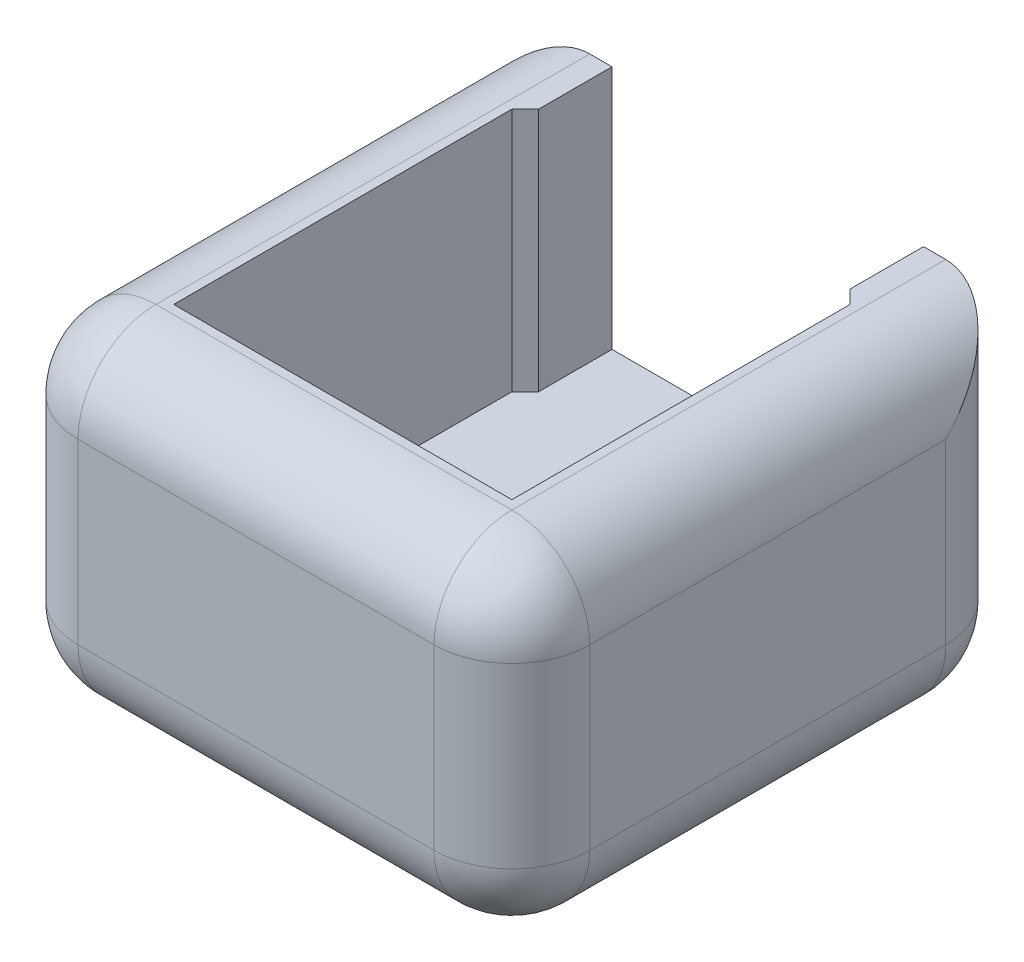
ISO-10303-21;
HEADER;
FILE_DESCRIPTION(('STEP AP214'),'2;1');
FILE_NAME('part.step','',(''),(''),'','','');
FILE_SCHEMA(('AUTOMOTIVE_DESIGN { 1 0 10303 214 1 1 1 1 }'));
ENDSEC;
DATA;
#1=APPLICATION_CONTEXT('core data for automotive mechanical design processes');
#2=APPLICATION_PROTOCOL_DEFINITION('international standard','automotive_design',2000,#1);
#3=PRODUCT_CONTEXT('',#1,'mechanical');
#4=PRODUCT('Part','Part','',(#3));
#5=PRODUCT_RELATED_PRODUCT_CATEGORY('part','',(#4));
#6=PRODUCT_DEFINITION_FORMATION('','',#4);
#7=PRODUCT_DEFINITION_CONTEXT('part definition',#1,'design');
#8=PRODUCT_DEFINITION('design','',#6,#7);
#9=PRODUCT_DEFINITION_SHAPE('','',#8);
#10=(LENGTH_UNIT() NAMED_UNIT(*) SI_UNIT(.MILLI.,.METRE.));
#11=(NAMED_UNIT(*) PLANE_ANGLE_UNIT() SI_UNIT($,.RADIAN.));
#12=(NAMED_UNIT(*) SI_UNIT($,.STERADIAN.) SOLID_ANGLE_UNIT());
#13=UNCERTAINTY_MEASURE_WITH_UNIT(LENGTH_MEASURE(1.E-05),#10,'distance_accuracy_value','');
#14=(GEOMETRIC_REPRESENTATION_CONTEXT(3) GLOBAL_UNCERTAINTY_ASSIGNED_CONTEXT((#13)) GLOBAL_UNIT_ASSIGNED_CONTEXT((#10,
#11,#12)) REPRESENTATION_CONTEXT('',''));
#15=CARTESIAN_POINT('',(0.,0.,0.));
#16=DIRECTION('',(0.,0.,1.));
#17=DIRECTION('',(1.,0.,0.));
#18=AXIS2_PLACEMENT_3D('',#15,#16,#17);
#19=CARTESIAN_POINT('',(23.,30.,23.));
#20=DIRECTION('',(-1.,0.,0.));
#21=DIRECTION('',(0.,0.,1.));
#22=AXIS2_PLACEMENT_3D('',#19,#20,#21);
#23=PLANE('',#22);
#24=DIRECTION('',(0.,0.,-1.));
#25=VECTOR('',#24,1.);
#26=CARTESIAN_POINT('',(23.,23.,23.));
#27=LINE('',#26,#25);
#28=CARTESIAN_POINT('',(23.,23.,-16.));
#29=VERTEX_POINT('',#28);
#30=CARTESIAN_POINT('',(23.,23.,16.));
#31=VERTEX_POINT('',#30);
#32=EDGE_CURVE('E294',#29,#31,#27,.F.);
#33=ORIENTED_EDGE('',*,*,#32,.T.);
#34=DIRECTION('',(0.,-1.,0.));
#35=VECTOR('',#34,1.);
#36=CARTESIAN_POINT('',(23.,30.,16.));
#37=LINE('',#36,#35);
#38=CARTESIAN_POINT('',(23.,7.,16.));
#39=VERTEX_POINT('',#38);
#40=EDGE_CURVE('E301',#31,#39,#37,.T.);
#41=ORIENTED_EDGE('',*,*,#40,.T.);
#42=DIRECTION('',(0.,0.,-1.));
#43=VECTOR('',#42,1.);
#44=CARTESIAN_POINT('',(23.,7.,-23.));
#45=LINE('',#44,#43);
#46=CARTESIAN_POINT('',(23.,7.,-16.));
#47=VERTEX_POINT('',#46);
#48=EDGE_CURVE('E297',#39,#47,#45,.T.);
#49=ORIENTED_EDGE('',*,*,#48,.T.);
#50=DIRECTION('',(0.,-1.,0.));
#51=VECTOR('',#50,1.);
#52=CARTESIAN_POINT('',(23.,30.,-16.));
#53=LINE('',#52,#51);
#54=EDGE_CURVE('E291',#47,#29,#53,.F.);
#55=ORIENTED_EDGE('',*,*,#54,.T.);
#56=EDGE_LOOP('',(#33,#41,#49,#55));
#57=FACE_BOUND('',#56,.T.);
#58=ADVANCED_FACE('F41',(#57),#23,.F.);
#59=CARTESIAN_POINT('',(-23.,30.,-23.));
#60=DIRECTION('',(0.,0.,1.));
#61=DIRECTION('',(1.,0.,0.));
#62=AXIS2_PLACEMENT_3D('',#59,#60,#61);
#63=PLANE('',#62);
#64=DIRECTION('',(-1.,0.,0.));
#65=VECTOR('',#64,1.);
#66=CARTESIAN_POINT('',(-23.,7.,-23.));
#67=LINE('',#66,#65);
#68=CARTESIAN_POINT('',(16.,7.,-23.));
#69=VERTEX_POINT('',#68);
#70=CARTESIAN_POINT('',(-16.,7.,-23.));
#71=VERTEX_POINT('',#70);
#72=EDGE_CURVE('E246',#69,#71,#67,.T.);
#73=ORIENTED_EDGE('',*,*,#72,.T.);
#74=DIRECTION('',(0.,-1.,0.));
#75=VECTOR('',#74,1.);
#76=CARTESIAN_POINT('',(-16.,30.,-23.));
#77=LINE('',#76,#75);
#78=CARTESIAN_POINT('',(-16.,30.,-23.));
#79=VERTEX_POINT('',#78);
#80=EDGE_CURVE('E249',#71,#79,#77,.F.);
#81=ORIENTED_EDGE('',*,*,#80,.T.);
#82=DIRECTION('',(-1.,0.,0.));
#83=VECTOR('',#82,1.);
#84=CARTESIAN_POINT('',(-23.,30.,-23.));
#85=LINE('',#84,#83);
#86=CARTESIAN_POINT('',(-14.,30.,-23.));
#87=VERTEX_POINT('',#86);
#88=EDGE_CURVE('E194',#87,#79,#85,.T.);
#89=ORIENTED_EDGE('',*,*,#88,.F.);
#90=DIRECTION('',(0.,1.,0.));
#91=VECTOR('',#90,1.);
#92=CARTESIAN_POINT('',(-14.,-21.0661314935442,-23.));
#93=LINE('',#92,#91);
#94=CARTESIAN_POINT('',(-14.,8.,-23.));
#95=VERTEX_POINT('',#94);
#96=EDGE_CURVE('E174',#95,#87,#93,.T.);
#97=ORIENTED_EDGE('',*,*,#96,.F.);
#98=DIRECTION('',(-1.,0.,0.));
#99=VECTOR('',#98,1.);
#100=CARTESIAN_POINT('',(-14.,8.,-23.));
#101=LINE('',#100,#99);
#102=CARTESIAN_POINT('',(14.,8.,-23.));
#103=VERTEX_POINT('',#102);
#104=EDGE_CURVE('E181',#103,#95,#101,.T.);
#105=ORIENTED_EDGE('',*,*,#104,.F.);
#106=DIRECTION('',(0.,1.,0.));
#107=VECTOR('',#106,1.);
#108=CARTESIAN_POINT('',(14.,-21.0661314935442,-23.));
#109=LINE('',#108,#107);
#110=CARTESIAN_POINT('',(14.,30.,-23.));
#111=VERTEX_POINT('',#110);
#112=EDGE_CURVE('E199',#103,#111,#109,.T.);
#113=ORIENTED_EDGE('',*,*,#112,.T.);
#114=CARTESIAN_POINT('',(16.,30.,-23.));
#115=VERTEX_POINT('',#114);
#116=EDGE_CURVE('E239',#115,#111,#85,.T.);
#117=ORIENTED_EDGE('',*,*,#116,.F.);
#118=DIRECTION('',(0.,-1.,0.));
#119=VECTOR('',#118,1.);
#120=CARTESIAN_POINT('',(16.,30.,-23.));
#121=LINE('',#120,#119);
#122=EDGE_CURVE('E243',#115,#69,#121,.T.);
#123=ORIENTED_EDGE('',*,*,#122,.T.);
#124=EDGE_LOOP('',(#73,#81,#89,#97,#105,#113,#117,#123));
#125=FACE_BOUND('',#124,.T.);
#126=ADVANCED_FACE('F192',(#125),#63,.F.);
#127=CARTESIAN_POINT('',(-23.,30.,23.));
#128=DIRECTION('',(1.,0.,0.));
#129=DIRECTION('',(0.,0.,-1.));
#130=AXIS2_PLACEMENT_3D('',#127,#128,#129);
#131=PLANE('',#130);
#132=DIRECTION('',(0.,0.,1.));
#133=VECTOR('',#132,1.);
#134=CARTESIAN_POINT('',(-23.,23.,23.));
#135=LINE('',#134,#133);
#136=CARTESIAN_POINT('',(-23.,23.,16.));
#137=VERTEX_POINT('',#136);
#138=CARTESIAN_POINT('',(-23.,23.,-16.));
#139=VERTEX_POINT('',#138);
#140=EDGE_CURVE('E268',#137,#139,#135,.F.);
#141=ORIENTED_EDGE('',*,*,#140,.T.);
#142=DIRECTION('',(0.,-1.,0.));
#143=VECTOR('',#142,1.);
#144=CARTESIAN_POINT('',(-23.,30.,-16.));
#145=LINE('',#144,#143);
#146=CARTESIAN_POINT('',(-23.,7.,-16.));
#147=VERTEX_POINT('',#146);
#148=EDGE_CURVE('E275',#139,#147,#145,.T.);
#149=ORIENTED_EDGE('',*,*,#148,.T.);
#150=DIRECTION('',(0.,0.,1.));
#151=VECTOR('',#150,1.);
#152=CARTESIAN_POINT('',(-23.,7.,23.));
#153=LINE('',#152,#151);
#154=CARTESIAN_POINT('',(-23.,7.,16.));
#155=VERTEX_POINT('',#154);
#156=EDGE_CURVE('E271',#147,#155,#153,.T.);
#157=ORIENTED_EDGE('',*,*,#156,.T.);
#158=DIRECTION('',(0.,-1.,0.));
#159=VECTOR('',#158,1.);
#160=CARTESIAN_POINT('',(-23.,30.,16.));
#161=LINE('',#160,#159);
#162=EDGE_CURVE('E265',#155,#137,#161,.F.);
#163=ORIENTED_EDGE('',*,*,#162,.T.);
#164=EDGE_LOOP('',(#141,#149,#157,#163));
#165=FACE_BOUND('',#164,.T.);
#166=ADVANCED_FACE('F439',(#165),#131,.F.);
#167=CARTESIAN_POINT('',(-23.,30.,23.));
#168=DIRECTION('',(0.,0.,-1.));
#169=DIRECTION('',(-1.,0.,0.));
#170=AXIS2_PLACEMENT_3D('',#167,#168,#169);
#171=PLANE('',#170);
#172=DIRECTION('',(1.,0.,0.));
#173=VECTOR('',#172,1.);
#174=CARTESIAN_POINT('',(-23.,23.,23.));
#175=LINE('',#174,#173);
#176=CARTESIAN_POINT('',(16.,23.,23.));
#177=VERTEX_POINT('',#176);
#178=CARTESIAN_POINT('',(-16.,23.,23.));
#179=VERTEX_POINT('',#178);
#180=EDGE_CURVE('E281',#177,#179,#175,.F.);
#181=ORIENTED_EDGE('',*,*,#180,.T.);
#182=DIRECTION('',(0.,-1.,0.));
#183=VECTOR('',#182,1.);
#184=CARTESIAN_POINT('',(-16.,30.,23.));
#185=LINE('',#184,#183);
#186=CARTESIAN_POINT('',(-16.,7.,23.));
#187=VERTEX_POINT('',#186);
#188=EDGE_CURVE('E288',#179,#187,#185,.T.);
#189=ORIENTED_EDGE('',*,*,#188,.T.);
#190=DIRECTION('',(1.,0.,0.));
#191=VECTOR('',#190,1.);
#192=CARTESIAN_POINT('',(23.,7.,23.));
#193=LINE('',#192,#191);
#194=CARTESIAN_POINT('',(16.,7.,23.));
#195=VERTEX_POINT('',#194);
#196=EDGE_CURVE('E284',#187,#195,#193,.T.);
#197=ORIENTED_EDGE('',*,*,#196,.T.);
#198=DIRECTION('',(0.,-1.,0.));
#199=VECTOR('',#198,1.);
#200=CARTESIAN_POINT('',(16.,30.,23.));
#201=LINE('',#200,#199);
#202=EDGE_CURVE('E278',#195,#177,#201,.F.);
#203=ORIENTED_EDGE('',*,*,#202,.T.);
#204=EDGE_LOOP('',(#181,#189,#197,#203));
#205=FACE_BOUND('',#204,.T.);
#206=ADVANCED_FACE('F528',(#205),#171,.F.);
#207=CARTESIAN_POINT('',(0.,30.,0.));
#208=DIRECTION('',(0.,-1.,0.));
#209=DIRECTION('',(0.,0.,-1.));
#210=AXIS2_PLACEMENT_3D('',#207,#208,#209);
#211=PLANE('',#210);
#212=DIRECTION('',(0.,0.,-1.));
#213=VECTOR('',#212,1.);
#214=CARTESIAN_POINT('',(14.,30.,-23.));
#215=LINE('',#214,#213);
#216=CARTESIAN_POINT('',(14.,30.,-16.4));
#217=VERTEX_POINT('',#216);
#218=EDGE_CURVE('E390',#217,#111,#215,.T.);
#219=ORIENTED_EDGE('',*,*,#218,.F.);
#220=DIRECTION('',(-0.707106781186548,0.,-0.707106781186547));
#221=VECTOR('',#220,1.);
#222=CARTESIAN_POINT('',(14.,30.,-16.4));
#223=LINE('',#222,#221);
#224=CARTESIAN_POINT('',(15.2,30.,-15.2));
#225=VERTEX_POINT('',#224);
#226=EDGE_CURVE('E400',#217,#225,#223,.F.);
#227=ORIENTED_EDGE('',*,*,#226,.T.);
#228=DIRECTION('',(0.,0.,-1.));
#229=VECTOR('',#228,1.);
#230=CARTESIAN_POINT('',(15.2,30.,15.2));
#231=LINE('',#230,#229);
#232=CARTESIAN_POINT('',(15.2,30.,15.2));
#233=VERTEX_POINT('',#232);
#234=EDGE_CURVE('E202',#233,#225,#231,.T.);
#235=ORIENTED_EDGE('',*,*,#234,.F.);
#236=DIRECTION('',(1.,0.,0.));
#237=VECTOR('',#236,1.);
#238=CARTESIAN_POINT('',(-15.2,30.,15.2));
#239=LINE('',#238,#237);
#240=CARTESIAN_POINT('',(-15.2,30.,15.2));
#241=VERTEX_POINT('',#240);
#242=EDGE_CURVE('E203',#241,#233,#239,.T.);
#243=ORIENTED_EDGE('',*,*,#242,.F.);
#244=DIRECTION('',(0.,0.,1.));
#245=VECTOR('',#244,1.);
#246=CARTESIAN_POINT('',(-15.2,30.,15.2));
#247=LINE('',#246,#245);
#248=CARTESIAN_POINT('',(-15.2,30.,-15.2));
#249=VERTEX_POINT('',#248);
#250=EDGE_CURVE('E207',#249,#241,#247,.T.);
#251=ORIENTED_EDGE('',*,*,#250,.F.);
#252=DIRECTION('',(-0.707106781186546,0.,0.707106781186549));
#253=VECTOR('',#252,1.);
#254=CARTESIAN_POINT('',(-15.2,30.,-15.2));
#255=LINE('',#254,#253);
#256=CARTESIAN_POINT('',(-14.,30.,-16.4));
#257=VERTEX_POINT('',#256);
#258=EDGE_CURVE('E65',#249,#257,#255,.F.);
#259=ORIENTED_EDGE('',*,*,#258,.T.);
#260=DIRECTION('',(0.,0.,1.));
#261=VECTOR('',#260,1.);
#262=CARTESIAN_POINT('',(-14.,30.,-23.));
#263=LINE('',#262,#261);
#264=EDGE_CURVE('E188',#87,#257,#263,.T.);
#265=ORIENTED_EDGE('',*,*,#264,.F.);
#266=ORIENTED_EDGE('',*,*,#88,.T.);
#267=DIRECTION('',(0.,0.,1.));
#268=VECTOR('',#267,1.);
#269=CARTESIAN_POINT('',(-16.,30.,0.));
#270=LINE('',#269,#268);
#271=CARTESIAN_POINT('',(-16.,30.,16.));
#272=VERTEX_POINT('',#271);
#273=EDGE_CURVE('E304',#79,#272,#270,.T.);
#274=ORIENTED_EDGE('',*,*,#273,.T.);
#275=DIRECTION('',(1.,0.,0.));
#276=VECTOR('',#275,1.);
#277=CARTESIAN_POINT('',(0.,30.,16.));
#278=LINE('',#277,#276);
#279=CARTESIAN_POINT('',(16.,30.,16.));
#280=VERTEX_POINT('',#279);
#281=EDGE_CURVE('E307',#272,#280,#278,.T.);
#282=ORIENTED_EDGE('',*,*,#281,.T.);
#283=DIRECTION('',(0.,0.,-1.));
#284=VECTOR('',#283,1.);
#285=CARTESIAN_POINT('',(16.,30.,0.));
#286=LINE('',#285,#284);
#287=EDGE_CURVE('E310',#280,#115,#286,.T.);
#288=ORIENTED_EDGE('',*,*,#287,.T.);
#289=ORIENTED_EDGE('',*,*,#116,.T.);
#290=EDGE_LOOP('',(#219,#227,#235,#243,#251,#259,#265,#266,#274,#282,#288,#289));
#291=FACE_BOUND('',#290,.T.);
#292=ADVANCED_FACE('F415',(#291),#211,.F.);
#293=CARTESIAN_POINT('',(0.,0.,0.));
#294=DIRECTION('',(0.,-1.,0.));
#295=DIRECTION('',(0.,0.,-1.));
#296=AXIS2_PLACEMENT_3D('',#293,#294,#295);
#297=PLANE('',#296);
#298=CARTESIAN_POINT('',(0.,0.,0.));
#299=DIRECTION('',(0.,-1.,0.));
#300=DIRECTION('',(0.,0.,-1.));
#301=AXIS2_PLACEMENT_3D('',#298,#299,#300);
#302=CIRCLE('',#301,5.5);
#303=CARTESIAN_POINT('',(0.,0.,-5.5));
#304=VERTEX_POINT('',#303);
#305=EDGE_CURVE('E804',#304,#304,#302,.T.);
#306=ORIENTED_EDGE('',*,*,#305,.F.);
#307=EDGE_LOOP('',(#306));
#308=FACE_BOUND('',#307,.T.);
#309=DIRECTION('',(0.,0.,1.));
#310=VECTOR('',#309,1.);
#311=CARTESIAN_POINT('',(-16.,0.,-23.));
#312=LINE('',#311,#310);
#313=CARTESIAN_POINT('',(-16.,0.,16.));
#314=VERTEX_POINT('',#313);
#315=CARTESIAN_POINT('',(-16.,0.,-16.));
#316=VERTEX_POINT('',#315);
#317=EDGE_CURVE('E258',#314,#316,#312,.F.);
#318=ORIENTED_EDGE('',*,*,#317,.T.);
#319=DIRECTION('',(-1.,0.,0.));
#320=VECTOR('',#319,1.);
#321=CARTESIAN_POINT('',(23.,0.,-16.));
#322=LINE('',#321,#320);
#323=CARTESIAN_POINT('',(16.,0.,-16.));
#324=VERTEX_POINT('',#323);
#325=EDGE_CURVE('E261',#316,#324,#322,.F.);
#326=ORIENTED_EDGE('',*,*,#325,.T.);
#327=DIRECTION('',(0.,0.,-1.));
#328=VECTOR('',#327,1.);
#329=CARTESIAN_POINT('',(16.,0.,23.));
#330=LINE('',#329,#328);
#331=CARTESIAN_POINT('',(16.,0.,16.));
#332=VERTEX_POINT('',#331);
#333=EDGE_CURVE('E252',#324,#332,#330,.F.);
#334=ORIENTED_EDGE('',*,*,#333,.T.);
#335=DIRECTION('',(1.,0.,0.));
#336=VECTOR('',#335,1.);
#337=CARTESIAN_POINT('',(-23.,0.,16.));
#338=LINE('',#337,#336);
#339=EDGE_CURVE('E255',#332,#314,#338,.F.);
#340=ORIENTED_EDGE('',*,*,#339,.T.);
#341=EDGE_LOOP('',(#318,#326,#334,#340));
#342=FACE_BOUND('',#341,.T.);
#343=ADVANCED_FACE('F562',(#308,#342),#297,.T.);
#344=CARTESIAN_POINT('',(0.,8.,0.));
#345=DIRECTION('',(0.,-1.,0.));
#346=DIRECTION('',(0.,0.,-1.));
#347=AXIS2_PLACEMENT_3D('',#344,#345,#346);
#348=PLANE('',#347);
#349=CARTESIAN_POINT('',(0.,8.,0.));
#350=DIRECTION('',(0.,-1.,0.));
#351=DIRECTION('',(0.,0.,-1.));
#352=AXIS2_PLACEMENT_3D('',#349,#350,#351);
#353=CIRCLE('',#352,3.1);
#354=CARTESIAN_POINT('',(0.,8.,-3.1));
#355=VERTEX_POINT('',#354);
#356=EDGE_CURVE('E318',#355,#355,#353,.T.);
#357=ORIENTED_EDGE('',*,*,#356,.T.);
#358=EDGE_LOOP('',(#357));
#359=FACE_BOUND('',#358,.T.);
#360=DIRECTION('',(0.,0.,-1.));
#361=VECTOR('',#360,1.);
#362=CARTESIAN_POINT('',(15.2,8.,15.2));
#363=LINE('',#362,#361);
#364=CARTESIAN_POINT('',(15.2,8.,15.2));
#365=VERTEX_POINT('',#364);
#366=CARTESIAN_POINT('',(15.2,8.,-15.2));
#367=VERTEX_POINT('',#366);
#368=EDGE_CURVE('E214',#365,#367,#363,.T.);
#369=ORIENTED_EDGE('',*,*,#368,.T.);
#370=DIRECTION('',(0.707106781186548,0.,0.707106781186547));
#371=VECTOR('',#370,1.);
#372=CARTESIAN_POINT('',(15.2,8.,-15.2));
#373=LINE('',#372,#371);
#374=CARTESIAN_POINT('',(14.,8.,-16.4));
#375=VERTEX_POINT('',#374);
#376=EDGE_CURVE('E50',#367,#375,#373,.F.);
#377=ORIENTED_EDGE('',*,*,#376,.T.);
#378=DIRECTION('',(0.,0.,-1.));
#379=VECTOR('',#378,1.);
#380=CARTESIAN_POINT('',(14.,8.,-23.));
#381=LINE('',#380,#379);
#382=EDGE_CURVE('E178',#375,#103,#381,.T.);
#383=ORIENTED_EDGE('',*,*,#382,.T.);
#384=ORIENTED_EDGE('',*,*,#104,.T.);
#385=DIRECTION('',(0.,0.,1.));
#386=VECTOR('',#385,1.);
#387=CARTESIAN_POINT('',(-14.,8.,-23.));
#388=LINE('',#387,#386);
#389=CARTESIAN_POINT('',(-14.,8.,-16.4));
#390=VERTEX_POINT('',#389);
#391=EDGE_CURVE('E170',#95,#390,#388,.T.);
#392=ORIENTED_EDGE('',*,*,#391,.T.);
#393=DIRECTION('',(0.707106781186546,0.,-0.707106781186549));
#394=VECTOR('',#393,1.);
#395=CARTESIAN_POINT('',(-15.2,8.,-15.2));
#396=LINE('',#395,#394);
#397=CARTESIAN_POINT('',(-15.2,8.,-15.2));
#398=VERTEX_POINT('',#397);
#399=EDGE_CURVE('E12',#390,#398,#396,.F.);
#400=ORIENTED_EDGE('',*,*,#399,.T.);
#401=DIRECTION('',(0.,0.,1.));
#402=VECTOR('',#401,1.);
#403=CARTESIAN_POINT('',(-15.2,8.,15.2));
#404=LINE('',#403,#402);
#405=CARTESIAN_POINT('',(-15.2,8.,15.2));
#406=VERTEX_POINT('',#405);
#407=EDGE_CURVE('E224',#398,#406,#404,.T.);
#408=ORIENTED_EDGE('',*,*,#407,.T.);
#409=DIRECTION('',(1.,0.,0.));
#410=VECTOR('',#409,1.);
#411=CARTESIAN_POINT('',(-15.2,8.,15.2));
#412=LINE('',#411,#410);
#413=EDGE_CURVE('E219',#406,#365,#412,.T.);
#414=ORIENTED_EDGE('',*,*,#413,.T.);
#415=EDGE_LOOP('',(#369,#377,#383,#384,#392,#400,#408,#414));
#416=FACE_BOUND('',#415,.T.);
#417=ADVANCED_FACE('F182',(#359,#416),#348,.F.);
#418=CARTESIAN_POINT('',(-15.2,-42.9920922961421,15.2));
#419=DIRECTION('',(-1.,0.,0.));
#420=DIRECTION('',(0.,0.,1.));
#421=AXIS2_PLACEMENT_3D('',#418,#419,#420);
#422=PLANE('',#421);
#423=DIRECTION('',(0.,1.,0.));
#424=VECTOR('',#423,1.);
#425=CARTESIAN_POINT('',(-15.2,-42.9920922961421,-15.2));
#426=LINE('',#425,#424);
#427=EDGE_CURVE('E206',#398,#249,#426,.T.);
#428=ORIENTED_EDGE('',*,*,#427,.T.);
#429=ORIENTED_EDGE('',*,*,#250,.T.);
#430=DIRECTION('',(0.,1.,0.));
#431=VECTOR('',#430,1.);
#432=CARTESIAN_POINT('',(-15.2,-42.9920922961421,15.2));
#433=LINE('',#432,#431);
#434=EDGE_CURVE('E223',#406,#241,#433,.T.);
#435=ORIENTED_EDGE('',*,*,#434,.F.);
#436=ORIENTED_EDGE('',*,*,#407,.F.);
#437=EDGE_LOOP('',(#428,#429,#435,#436));
#438=FACE_BOUND('',#437,.T.);
#439=ADVANCED_FACE('F426',(#438),#422,.F.);
#440=CARTESIAN_POINT('',(-15.2,-42.9920922961421,15.2));
#441=DIRECTION('',(0.,0.,1.));
#442=DIRECTION('',(1.,0.,0.));
#443=AXIS2_PLACEMENT_3D('',#440,#441,#442);
#444=PLANE('',#443);
#445=ORIENTED_EDGE('',*,*,#434,.T.);
#446=ORIENTED_EDGE('',*,*,#242,.T.);
#447=DIRECTION('',(0.,1.,0.));
#448=VECTOR('',#447,1.);
#449=CARTESIAN_POINT('',(15.2,-42.9920922961421,15.2));
#450=LINE('',#449,#448);
#451=EDGE_CURVE('E218',#365,#233,#450,.T.);
#452=ORIENTED_EDGE('',*,*,#451,.F.);
#453=ORIENTED_EDGE('',*,*,#413,.F.);
#454=EDGE_LOOP('',(#445,#446,#452,#453));
#455=FACE_BOUND('',#454,.T.);
#456=ADVANCED_FACE('F421',(#455),#444,.F.);
#457=CARTESIAN_POINT('',(15.2,-42.9920922961421,15.2));
#458=DIRECTION('',(1.,0.,0.));
#459=DIRECTION('',(0.,0.,-1.));
#460=AXIS2_PLACEMENT_3D('',#457,#458,#459);
#461=PLANE('',#460);
#462=ORIENTED_EDGE('',*,*,#451,.T.);
#463=ORIENTED_EDGE('',*,*,#234,.T.);
#464=DIRECTION('',(0.,1.,0.));
#465=VECTOR('',#464,1.);
#466=CARTESIAN_POINT('',(15.2,-42.9920922961421,-15.2));
#467=LINE('',#466,#465);
#468=EDGE_CURVE('E217',#367,#225,#467,.T.);
#469=ORIENTED_EDGE('',*,*,#468,.F.);
#470=ORIENTED_EDGE('',*,*,#368,.F.);
#471=EDGE_LOOP('',(#462,#463,#469,#470));
#472=FACE_BOUND('',#471,.T.);
#473=ADVANCED_FACE('F418',(#472),#461,.F.);
#474=CARTESIAN_POINT('',(-14.,-21.0661314935442,-23.));
#475=DIRECTION('',(-1.,0.,0.));
#476=DIRECTION('',(0.,0.,1.));
#477=AXIS2_PLACEMENT_3D('',#474,#475,#476);
#478=PLANE('',#477);
#479=ORIENTED_EDGE('',*,*,#264,.T.);
#480=DIRECTION('',(0.,-1.,0.));
#481=VECTOR('',#480,1.);
#482=CARTESIAN_POINT('',(-14.,-21.0661314935442,-16.4));
#483=LINE('',#482,#481);
#484=EDGE_CURVE('E57',#257,#390,#483,.T.);
#485=ORIENTED_EDGE('',*,*,#484,.T.);
#486=ORIENTED_EDGE('',*,*,#391,.F.);
#487=ORIENTED_EDGE('',*,*,#96,.T.);
#488=EDGE_LOOP('',(#479,#485,#486,#487));
#489=FACE_BOUND('',#488,.T.);
#490=ADVANCED_FACE('F172',(#489),#478,.F.);
#491=CARTESIAN_POINT('',(14.,-21.0661314935442,-23.));
#492=DIRECTION('',(1.,0.,0.));
#493=DIRECTION('',(0.,0.,-1.));
#494=AXIS2_PLACEMENT_3D('',#491,#492,#493);
#495=PLANE('',#494);
#496=ORIENTED_EDGE('',*,*,#382,.F.);
#497=DIRECTION('',(0.,1.,0.));
#498=VECTOR('',#497,1.);
#499=CARTESIAN_POINT('',(14.,-21.0661314935442,-16.4));
#500=LINE('',#499,#498);
#501=EDGE_CURVE('E313',#375,#217,#500,.T.);
#502=ORIENTED_EDGE('',*,*,#501,.T.);
#503=ORIENTED_EDGE('',*,*,#218,.T.);
#504=ORIENTED_EDGE('',*,*,#112,.F.);
#505=EDGE_LOOP('',(#496,#502,#503,#504));
#506=FACE_BOUND('',#505,.T.);
#507=ADVANCED_FACE('F410',(#506),#495,.F.);
#508=CARTESIAN_POINT('',(0.,23.,16.));
#509=DIRECTION('',(1.,0.,0.));
#510=DIRECTION('',(0.,0.,-1.));
#511=AXIS2_PLACEMENT_3D('',#508,#509,#510);
#512=CYLINDRICAL_SURFACE('',#511,7.);
#513=CARTESIAN_POINT('',(-16.,23.,16.));
#514=DIRECTION('',(-1.,0.,0.));
#515=DIRECTION('',(0.,0.,1.));
#516=AXIS2_PLACEMENT_3D('',#513,#514,#515);
#517=CIRCLE('',#516,7.);
#518=EDGE_CURVE('E378',#179,#272,#517,.T.);
#519=ORIENTED_EDGE('',*,*,#518,.F.);
#520=ORIENTED_EDGE('',*,*,#180,.F.);
#521=CARTESIAN_POINT('',(16.,23.,16.));
#522=DIRECTION('',(1.,0.,0.));
#523=DIRECTION('',(0.,0.,-1.));
#524=AXIS2_PLACEMENT_3D('',#521,#522,#523);
#525=CIRCLE('',#524,7.);
#526=EDGE_CURVE('E382',#280,#177,#525,.T.);
#527=ORIENTED_EDGE('',*,*,#526,.F.);
#528=ORIENTED_EDGE('',*,*,#281,.F.);
#529=EDGE_LOOP('',(#519,#520,#527,#528));
#530=FACE_BOUND('',#529,.T.);
#531=ADVANCED_FACE('F507',(#530),#512,.T.);
#532=CARTESIAN_POINT('',(16.,30.,16.));
#533=DIRECTION('',(0.,-1.,0.));
#534=DIRECTION('',(0.,0.,-1.));
#535=AXIS2_PLACEMENT_3D('',#532,#533,#534);
#536=CYLINDRICAL_SURFACE('',#535,7.);
#537=CARTESIAN_POINT('',(16.,23.,16.));
#538=DIRECTION('',(0.,1.,0.));
#539=DIRECTION('',(0.,0.,1.));
#540=AXIS2_PLACEMENT_3D('',#537,#538,#539);
#541=CIRCLE('',#540,7.);
#542=EDGE_CURVE('E386',#177,#31,#541,.T.);
#543=ORIENTED_EDGE('',*,*,#542,.F.);
#544=ORIENTED_EDGE('',*,*,#202,.F.);
#545=CARTESIAN_POINT('',(16.,7.,16.));
#546=DIRECTION('',(0.,-1.,0.));
#547=DIRECTION('',(0.,0.,-1.));
#548=AXIS2_PLACEMENT_3D('',#545,#546,#547);
#549=CIRCLE('',#548,7.);
#550=EDGE_CURVE('E367',#39,#195,#549,.T.);
#551=ORIENTED_EDGE('',*,*,#550,.F.);
#552=ORIENTED_EDGE('',*,*,#40,.F.);
#553=EDGE_LOOP('',(#543,#544,#551,#552));
#554=FACE_BOUND('',#553,.T.);
#555=ADVANCED_FACE('F503',(#554),#536,.T.);
#556=CARTESIAN_POINT('',(16.,23.,16.));
#557=DIRECTION('',(0.,0.,1.));
#558=DIRECTION('',(1.,0.,0.));
#559=AXIS2_PLACEMENT_3D('',#556,#557,#558);
#560=SPHERICAL_SURFACE('',#559,7.);
#561=ORIENTED_EDGE('',*,*,#526,.T.);
#562=ORIENTED_EDGE('',*,*,#542,.T.);
#563=CARTESIAN_POINT('',(16.,23.,16.));
#564=DIRECTION('',(0.,0.,1.));
#565=DIRECTION('',(1.,0.,0.));
#566=AXIS2_PLACEMENT_3D('',#563,#564,#565);
#567=CIRCLE('',#566,7.);
#568=EDGE_CURVE('E363',#280,#31,#567,.F.);
#569=ORIENTED_EDGE('',*,*,#568,.F.);
#570=EDGE_LOOP('',(#561,#562,#569));
#571=FACE_BOUND('',#570,.T.);
#572=ADVANCED_FACE('F499',(#571),#560,.T.);
#573=CARTESIAN_POINT('',(-16.,23.,16.));
#574=DIRECTION('',(0.,0.,1.));
#575=DIRECTION('',(1.,0.,0.));
#576=AXIS2_PLACEMENT_3D('',#573,#574,#575);
#577=SPHERICAL_SURFACE('',#576,7.);
#578=CARTESIAN_POINT('',(-16.,23.,16.));
#579=DIRECTION('',(0.,0.,1.));
#580=DIRECTION('',(1.,0.,0.));
#581=AXIS2_PLACEMENT_3D('',#578,#579,#580);
#582=CIRCLE('',#581,7.);
#583=EDGE_CURVE('E359',#137,#272,#582,.F.);
#584=ORIENTED_EDGE('',*,*,#583,.F.);
#585=CARTESIAN_POINT('',(-16.,23.,16.));
#586=DIRECTION('',(0.,1.,0.));
#587=DIRECTION('',(0.,0.,1.));
#588=AXIS2_PLACEMENT_3D('',#585,#586,#587);
#589=CIRCLE('',#588,7.);
#590=EDGE_CURVE('E374',#179,#137,#589,.F.);
#591=ORIENTED_EDGE('',*,*,#590,.F.);
#592=ORIENTED_EDGE('',*,*,#518,.T.);
#593=EDGE_LOOP('',(#584,#591,#592));
#594=FACE_BOUND('',#593,.T.);
#595=ADVANCED_FACE('F495',(#594),#577,.T.);
#596=CARTESIAN_POINT('',(-16.,30.,16.));
#597=DIRECTION('',(0.,-1.,0.));
#598=DIRECTION('',(0.,0.,-1.));
#599=AXIS2_PLACEMENT_3D('',#596,#597,#598);
#600=CYLINDRICAL_SURFACE('',#599,7.);
#601=ORIENTED_EDGE('',*,*,#590,.T.);
#602=ORIENTED_EDGE('',*,*,#162,.F.);
#603=CARTESIAN_POINT('',(-16.,7.,16.));
#604=DIRECTION('',(0.,-1.,0.));
#605=DIRECTION('',(0.,0.,-1.));
#606=AXIS2_PLACEMENT_3D('',#603,#604,#605);
#607=CIRCLE('',#606,7.);
#608=EDGE_CURVE('E355',#187,#155,#607,.T.);
#609=ORIENTED_EDGE('',*,*,#608,.F.);
#610=ORIENTED_EDGE('',*,*,#188,.F.);
#611=EDGE_LOOP('',(#601,#602,#609,#610));
#612=FACE_BOUND('',#611,.T.);
#613=ADVANCED_FACE('F491',(#612),#600,.T.);
#614=CARTESIAN_POINT('',(-23.,7.,16.));
#615=DIRECTION('',(-1.,0.,0.));
#616=DIRECTION('',(0.,0.,1.));
#617=AXIS2_PLACEMENT_3D('',#614,#615,#616);
#618=CYLINDRICAL_SURFACE('',#617,7.);
#619=CARTESIAN_POINT('',(16.,7.,16.));
#620=DIRECTION('',(1.,0.,0.));
#621=DIRECTION('',(0.,0.,-1.));
#622=AXIS2_PLACEMENT_3D('',#619,#620,#621);
#623=CIRCLE('',#622,7.);
#624=EDGE_CURVE('E370',#195,#332,#623,.T.);
#625=ORIENTED_EDGE('',*,*,#624,.F.);
#626=ORIENTED_EDGE('',*,*,#196,.F.);
#627=CARTESIAN_POINT('',(-16.,7.,16.));
#628=DIRECTION('',(-1.,0.,0.));
#629=DIRECTION('',(0.,0.,1.));
#630=AXIS2_PLACEMENT_3D('',#627,#628,#629);
#631=CIRCLE('',#630,7.);
#632=EDGE_CURVE('E351',#314,#187,#631,.T.);
#633=ORIENTED_EDGE('',*,*,#632,.F.);
#634=ORIENTED_EDGE('',*,*,#339,.F.);
#635=EDGE_LOOP('',(#625,#626,#633,#634));
#636=FACE_BOUND('',#635,.T.);
#637=ADVANCED_FACE('F487',(#636),#618,.T.);
#638=CARTESIAN_POINT('',(16.,7.,16.));
#639=DIRECTION('',(0.,0.,1.));
#640=DIRECTION('',(1.,0.,0.));
#641=AXIS2_PLACEMENT_3D('',#638,#639,#640);
#642=SPHERICAL_SURFACE('',#641,7.);
#643=ORIENTED_EDGE('',*,*,#550,.T.);
#644=ORIENTED_EDGE('',*,*,#624,.T.);
#645=CARTESIAN_POINT('',(16.,7.,16.));
#646=DIRECTION('',(0.,0.,1.));
#647=DIRECTION('',(1.,0.,0.));
#648=AXIS2_PLACEMENT_3D('',#645,#646,#647);
#649=CIRCLE('',#648,7.);
#650=EDGE_CURVE('E347',#39,#332,#649,.F.);
#651=ORIENTED_EDGE('',*,*,#650,.F.);
#652=EDGE_LOOP('',(#643,#644,#651));
#653=FACE_BOUND('',#652,.T.);
#654=ADVANCED_FACE('F483',(#653),#642,.T.);
#655=CARTESIAN_POINT('',(16.,23.,0.));
#656=DIRECTION('',(0.,0.,-1.));
#657=DIRECTION('',(-1.,0.,0.));
#658=AXIS2_PLACEMENT_3D('',#655,#656,#657);
#659=CYLINDRICAL_SURFACE('',#658,7.);
#660=ORIENTED_EDGE('',*,*,#568,.T.);
#661=ORIENTED_EDGE('',*,*,#32,.F.);
#662=CARTESIAN_POINT('',(16.,23.,-16.));
#663=DIRECTION('',(0.,-0.707106781186547,-0.707106781186547));
#664=DIRECTION('',(0.,-0.707106781186547,0.707106781186547));
#665=AXIS2_PLACEMENT_3D('',#662,#663,#664);
#666=ELLIPSE('',#665,9.89949493661167,7.);
#667=EDGE_CURVE('E343',#115,#29,#666,.T.);
#668=ORIENTED_EDGE('',*,*,#667,.F.);
#669=ORIENTED_EDGE('',*,*,#287,.F.);
#670=EDGE_LOOP('',(#660,#661,#668,#669));
#671=FACE_BOUND('',#670,.T.);
#672=ADVANCED_FACE('F479',(#671),#659,.T.);
#673=CARTESIAN_POINT('',(-16.,23.,0.));
#674=DIRECTION('',(0.,0.,1.));
#675=DIRECTION('',(1.,0.,0.));
#676=AXIS2_PLACEMENT_3D('',#673,#674,#675);
#677=CYLINDRICAL_SURFACE('',#676,7.);
#678=ORIENTED_EDGE('',*,*,#583,.T.);
#679=ORIENTED_EDGE('',*,*,#273,.F.);
#680=CARTESIAN_POINT('',(-16.,23.,-16.));
#681=DIRECTION('',(0.,-0.707106781186547,-0.707106781186547));
#682=DIRECTION('',(0.,-0.707106781186547,0.707106781186547));
#683=AXIS2_PLACEMENT_3D('',#680,#681,#682);
#684=ELLIPSE('',#683,9.89949493661167,7.);
#685=EDGE_CURVE('E339',#139,#79,#684,.T.);
#686=ORIENTED_EDGE('',*,*,#685,.F.);
#687=ORIENTED_EDGE('',*,*,#140,.F.);
#688=EDGE_LOOP('',(#678,#679,#686,#687));
#689=FACE_BOUND('',#688,.T.);
#690=ADVANCED_FACE('F475',(#689),#677,.T.);
#691=CARTESIAN_POINT('',(-16.,7.,16.));
#692=DIRECTION('',(0.,0.,1.));
#693=DIRECTION('',(1.,0.,0.));
#694=AXIS2_PLACEMENT_3D('',#691,#692,#693);
#695=SPHERICAL_SURFACE('',#694,7.);
#696=ORIENTED_EDGE('',*,*,#632,.T.);
#697=ORIENTED_EDGE('',*,*,#608,.T.);
#698=CARTESIAN_POINT('',(-16.,7.,16.));
#699=DIRECTION('',(0.,0.,1.));
#700=DIRECTION('',(1.,0.,0.));
#701=AXIS2_PLACEMENT_3D('',#698,#699,#700);
#702=CIRCLE('',#701,7.);
#703=EDGE_CURVE('E336',#314,#155,#702,.F.);
#704=ORIENTED_EDGE('',*,*,#703,.F.);
#705=EDGE_LOOP('',(#696,#697,#704));
#706=FACE_BOUND('',#705,.T.);
#707=ADVANCED_FACE('F471',(#706),#695,.T.);
#708=CARTESIAN_POINT('',(16.,7.,23.));
#709=DIRECTION('',(0.,0.,1.));
#710=DIRECTION('',(1.,0.,0.));
#711=AXIS2_PLACEMENT_3D('',#708,#709,#710);
#712=CYLINDRICAL_SURFACE('',#711,7.);
#713=ORIENTED_EDGE('',*,*,#650,.T.);
#714=ORIENTED_EDGE('',*,*,#333,.F.);
#715=CARTESIAN_POINT('',(16.,7.,-16.));
#716=DIRECTION('',(0.,0.,-1.));
#717=DIRECTION('',(-1.,0.,0.));
#718=AXIS2_PLACEMENT_3D('',#715,#716,#717);
#719=CIRCLE('',#718,7.);
#720=EDGE_CURVE('E332',#47,#324,#719,.T.);
#721=ORIENTED_EDGE('',*,*,#720,.F.);
#722=ORIENTED_EDGE('',*,*,#48,.F.);
#723=EDGE_LOOP('',(#713,#714,#721,#722));
#724=FACE_BOUND('',#723,.T.);
#725=ADVANCED_FACE('F467',(#724),#712,.T.);
#726=CARTESIAN_POINT('',(16.,30.,-16.));
#727=DIRECTION('',(0.,-1.,0.));
#728=DIRECTION('',(0.,0.,-1.));
#729=AXIS2_PLACEMENT_3D('',#726,#727,#728);
#730=CYLINDRICAL_SURFACE('',#729,7.);
#731=ORIENTED_EDGE('',*,*,#667,.T.);
#732=ORIENTED_EDGE('',*,*,#54,.F.);
#733=CARTESIAN_POINT('',(16.,7.,-16.));
#734=DIRECTION('',(0.,-1.,0.));
#735=DIRECTION('',(0.,0.,-1.));
#736=AXIS2_PLACEMENT_3D('',#733,#734,#735);
#737=CIRCLE('',#736,7.);
#738=EDGE_CURVE('E329',#69,#47,#737,.T.);
#739=ORIENTED_EDGE('',*,*,#738,.F.);
#740=ORIENTED_EDGE('',*,*,#122,.F.);
#741=EDGE_LOOP('',(#731,#732,#739,#740));
#742=FACE_BOUND('',#741,.T.);
#743=ADVANCED_FACE('F463',(#742),#730,.T.);
#744=CARTESIAN_POINT('',(-16.,30.,-16.));
#745=DIRECTION('',(0.,-1.,0.));
#746=DIRECTION('',(0.,0.,-1.));
#747=AXIS2_PLACEMENT_3D('',#744,#745,#746);
#748=CYLINDRICAL_SURFACE('',#747,7.);
#749=ORIENTED_EDGE('',*,*,#685,.T.);
#750=ORIENTED_EDGE('',*,*,#80,.F.);
#751=CARTESIAN_POINT('',(-16.,7.,-16.));
#752=DIRECTION('',(0.,-1.,0.));
#753=DIRECTION('',(0.,0.,-1.));
#754=AXIS2_PLACEMENT_3D('',#751,#752,#753);
#755=CIRCLE('',#754,7.);
#756=EDGE_CURVE('E325',#147,#71,#755,.T.);
#757=ORIENTED_EDGE('',*,*,#756,.F.);
#758=ORIENTED_EDGE('',*,*,#148,.F.);
#759=EDGE_LOOP('',(#749,#750,#757,#758));
#760=FACE_BOUND('',#759,.T.);
#761=ADVANCED_FACE('F459',(#760),#748,.T.);
#762=CARTESIAN_POINT('',(-16.,7.,23.));
#763=DIRECTION('',(0.,0.,-1.));
#764=DIRECTION('',(-1.,0.,0.));
#765=AXIS2_PLACEMENT_3D('',#762,#763,#764);
#766=CYLINDRICAL_SURFACE('',#765,7.);
#767=ORIENTED_EDGE('',*,*,#703,.T.);
#768=ORIENTED_EDGE('',*,*,#156,.F.);
#769=CARTESIAN_POINT('',(-16.,7.,-16.));
#770=DIRECTION('',(0.,0.,-1.));
#771=DIRECTION('',(-1.,0.,0.));
#772=AXIS2_PLACEMENT_3D('',#769,#770,#771);
#773=CIRCLE('',#772,7.);
#774=EDGE_CURVE('E321',#316,#147,#773,.T.);
#775=ORIENTED_EDGE('',*,*,#774,.F.);
#776=ORIENTED_EDGE('',*,*,#317,.F.);
#777=EDGE_LOOP('',(#767,#768,#775,#776));
#778=FACE_BOUND('',#777,.T.);
#779=ADVANCED_FACE('F455',(#778),#766,.T.);
#780=CARTESIAN_POINT('',(16.,7.,-16.));
#781=DIRECTION('',(0.,0.,1.));
#782=DIRECTION('',(1.,0.,0.));
#783=AXIS2_PLACEMENT_3D('',#780,#781,#782);
#784=SPHERICAL_SURFACE('',#783,7.);
#785=ORIENTED_EDGE('',*,*,#738,.T.);
#786=ORIENTED_EDGE('',*,*,#720,.T.);
#787=CARTESIAN_POINT('',(16.,7.,-16.));
#788=DIRECTION('',(1.,0.,0.));
#789=DIRECTION('',(0.,0.,-1.));
#790=AXIS2_PLACEMENT_3D('',#787,#788,#789);
#791=CIRCLE('',#790,7.);
#792=EDGE_CURVE('E317',#69,#324,#791,.F.);
#793=ORIENTED_EDGE('',*,*,#792,.F.);
#794=EDGE_LOOP('',(#785,#786,#793));
#795=FACE_BOUND('',#794,.T.);
#796=ADVANCED_FACE('F451',(#795),#784,.T.);
#797=CARTESIAN_POINT('',(-16.,7.,-16.));
#798=DIRECTION('',(0.,0.,1.));
#799=DIRECTION('',(1.,0.,0.));
#800=AXIS2_PLACEMENT_3D('',#797,#798,#799);
#801=SPHERICAL_SURFACE('',#800,7.);
#802=ORIENTED_EDGE('',*,*,#774,.T.);
#803=ORIENTED_EDGE('',*,*,#756,.T.);
#804=CARTESIAN_POINT('',(-16.,7.,-16.));
#805=DIRECTION('',(-1.,0.,0.));
#806=DIRECTION('',(0.,0.,1.));
#807=AXIS2_PLACEMENT_3D('',#804,#805,#806);
#808=CIRCLE('',#807,7.);
#809=EDGE_CURVE('E314',#316,#71,#808,.F.);
#810=ORIENTED_EDGE('',*,*,#809,.F.);
#811=EDGE_LOOP('',(#802,#803,#810));
#812=FACE_BOUND('',#811,.T.);
#813=ADVANCED_FACE('F447',(#812),#801,.T.);
#814=CARTESIAN_POINT('',(-23.,7.,-16.));
#815=DIRECTION('',(1.,0.,0.));
#816=DIRECTION('',(0.,0.,-1.));
#817=AXIS2_PLACEMENT_3D('',#814,#815,#816);
#818=CYLINDRICAL_SURFACE('',#817,7.);
#819=ORIENTED_EDGE('',*,*,#792,.T.);
#820=ORIENTED_EDGE('',*,*,#325,.F.);
#821=ORIENTED_EDGE('',*,*,#809,.T.);
#822=ORIENTED_EDGE('',*,*,#72,.F.);
#823=EDGE_LOOP('',(#819,#820,#821,#822));
#824=FACE_BOUND('',#823,.T.);
#825=ADVANCED_FACE('F443',(#824),#818,.T.);
#826=CARTESIAN_POINT('',(0.,0.,0.));
#827=DIRECTION('',(0.,-1.,0.));
#828=DIRECTION('',(0.,0.,-1.));
#829=AXIS2_PLACEMENT_3D('',#826,#827,#828);
#830=CYLINDRICAL_SURFACE('',#829,3.1);
#831=CARTESIAN_POINT('',(0.,5.,0.));
#832=DIRECTION('',(0.,-1.,0.));
#833=DIRECTION('',(0.,0.,-1.));
#834=AXIS2_PLACEMENT_3D('',#831,#832,#833);
#835=CIRCLE('',#834,3.1);
#836=CARTESIAN_POINT('',(0.,5.,-3.1));
#837=VERTEX_POINT('',#836);
#838=EDGE_CURVE('E394',#837,#837,#835,.T.);
#839=ORIENTED_EDGE('',*,*,#838,.T.);
#840=EDGE_LOOP('',(#839));
#841=FACE_BOUND('',#840,.T.);
#842=ORIENTED_EDGE('',*,*,#356,.F.);
#843=EDGE_LOOP('',(#842));
#844=FACE_BOUND('',#843,.T.);
#845=ADVANCED_FACE('F446',(#841,#844),#830,.F.);
#846=CARTESIAN_POINT('',(3.1,5.,0.));
#847=DIRECTION('',(0.,1.,0.));
#848=DIRECTION('',(0.,0.,1.));
#849=AXIS2_PLACEMENT_3D('',#846,#847,#848);
#850=PLANE('',#849);
#851=ORIENTED_EDGE('',*,*,#838,.F.);
#852=EDGE_LOOP('',(#851));
#853=FACE_BOUND('',#852,.T.);
#854=CARTESIAN_POINT('',(0.,5.,0.));
#855=DIRECTION('',(0.,-1.,0.));
#856=DIRECTION('',(0.,0.,-1.));
#857=AXIS2_PLACEMENT_3D('',#854,#855,#856);
#858=CIRCLE('',#857,5.5);
#859=CARTESIAN_POINT('',(0.,5.,-5.5));
#860=VERTEX_POINT('',#859);
#861=EDGE_CURVE('E800',#860,#860,#858,.T.);
#862=ORIENTED_EDGE('',*,*,#861,.T.);
#863=EDGE_LOOP('',(#862));
#864=FACE_BOUND('',#863,.T.);
#865=ADVANCED_FACE('F652',(#853,#864),#850,.F.);
#866=CARTESIAN_POINT('',(0.,0.,0.));
#867=DIRECTION('',(0.,-1.,0.));
#868=DIRECTION('',(0.,0.,-1.));
#869=AXIS2_PLACEMENT_3D('',#866,#867,#868);
#870=CYLINDRICAL_SURFACE('',#869,5.5);
#871=ORIENTED_EDGE('',*,*,#861,.F.);
#872=EDGE_LOOP('',(#871));
#873=FACE_BOUND('',#872,.T.);
#874=ORIENTED_EDGE('',*,*,#305,.T.);
#875=EDGE_LOOP('',(#874));
#876=FACE_BOUND('',#875,.T.);
#877=ADVANCED_FACE('F432',(#873,#876),#870,.F.);
#878=CARTESIAN_POINT('',(14.,-21.0661314935442,-16.4));
#879=DIRECTION('',(0.707106781186547,0.,-0.707106781186548));
#880=DIRECTION('',(0.,1.,0.));
#881=AXIS2_PLACEMENT_3D('',#878,#879,#880);
#882=PLANE('',#881);
#883=ORIENTED_EDGE('',*,*,#376,.F.);
#884=ORIENTED_EDGE('',*,*,#468,.T.);
#885=ORIENTED_EDGE('',*,*,#226,.F.);
#886=ORIENTED_EDGE('',*,*,#501,.F.);
#887=EDGE_LOOP('',(#883,#884,#885,#886));
#888=FACE_BOUND('',#887,.T.);
#889=ADVANCED_FACE('F413',(#888),#882,.F.);
#890=CARTESIAN_POINT('',(-15.2,-42.9920922961421,-15.2));
#891=DIRECTION('',(-0.707106781186549,0.,-0.707106781186546));
#892=DIRECTION('',(0.,1.,0.));
#893=AXIS2_PLACEMENT_3D('',#890,#891,#892);
#894=PLANE('',#893);
#895=ORIENTED_EDGE('',*,*,#399,.F.);
#896=ORIENTED_EDGE('',*,*,#484,.F.);
#897=ORIENTED_EDGE('',*,*,#258,.F.);
#898=ORIENTED_EDGE('',*,*,#427,.F.);
#899=EDGE_LOOP('',(#895,#896,#897,#898));
#900=FACE_BOUND('',#899,.T.);
#901=ADVANCED_FACE('F43',(#900),#894,.F.);
#902=CLOSED_SHELL('',(#58,#126,#166,#206,#292,#343,#417,#439,#456,#473,#490,#507,#531,#555,#572,
#595,#613,#637,#654,#672,#690,#707,#725,#743,#761,#779,#796,#813,#825,#845,#865,#877,#889,#901));
#903=MANIFOLD_SOLID_BREP('B2',#902);
#904=ADVANCED_BREP_SHAPE_REPRESENTATION('',(#18,#903),#14);
#905=SHAPE_DEFINITION_REPRESENTATION(#9,#904);
ENDSEC;
END-ISO-10303-21;
